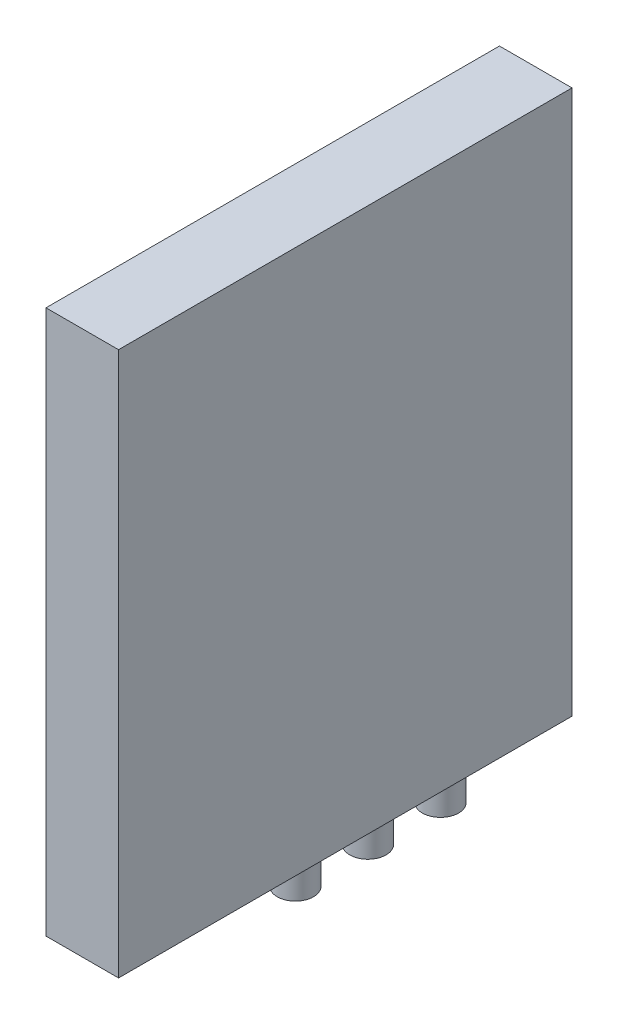
ISO-10303-21;
HEADER;
FILE_DESCRIPTION(('STEP AP214'),'2;1');
FILE_NAME('part.step','',(''),(''),'','','');
FILE_SCHEMA(('AUTOMOTIVE_DESIGN { 1 0 10303 214 1 1 1 1 }'));
ENDSEC;
DATA;
#1=APPLICATION_CONTEXT('core data for automotive mechanical design processes');
#2=APPLICATION_PROTOCOL_DEFINITION('international standard','automotive_design',2000,#1);
#3=PRODUCT_CONTEXT('',#1,'mechanical');
#4=PRODUCT('Part','Part','',(#3));
#5=PRODUCT_RELATED_PRODUCT_CATEGORY('part','',(#4));
#6=PRODUCT_DEFINITION_FORMATION('','',#4);
#7=PRODUCT_DEFINITION_CONTEXT('part definition',#1,'design');
#8=PRODUCT_DEFINITION('design','',#6,#7);
#9=PRODUCT_DEFINITION_SHAPE('','',#8);
#10=(LENGTH_UNIT() NAMED_UNIT(*) SI_UNIT(.MILLI.,.METRE.));
#11=(NAMED_UNIT(*) PLANE_ANGLE_UNIT() SI_UNIT($,.RADIAN.));
#12=(NAMED_UNIT(*) SI_UNIT($,.STERADIAN.) SOLID_ANGLE_UNIT());
#13=UNCERTAINTY_MEASURE_WITH_UNIT(LENGTH_MEASURE(1.E-05),#10,'distance_accuracy_value','');
#14=(GEOMETRIC_REPRESENTATION_CONTEXT(3) GLOBAL_UNCERTAINTY_ASSIGNED_CONTEXT((#13)) GLOBAL_UNIT_ASSIGNED_CONTEXT((#10,
#11,#12)) REPRESENTATION_CONTEXT('',''));
#15=CARTESIAN_POINT('',(0.,0.,0.));
#16=DIRECTION('',(0.,0.,1.));
#17=DIRECTION('',(1.,0.,0.));
#18=AXIS2_PLACEMENT_3D('',#15,#16,#17);
#19=CARTESIAN_POINT('',(-15.731065886484,60.,0.));
#20=DIRECTION('',(1.,0.,0.));
#21=DIRECTION('',(0.,0.,-1.));
#22=AXIS2_PLACEMENT_3D('',#19,#20,#21);
#23=PLANE('',#22);
#24=DIRECTION('',(0.,0.,1.));
#25=VECTOR('',#24,1.);
#26=CARTESIAN_POINT('',(-15.731065886484,0.,0.));
#27=LINE('',#26,#25);
#28=CARTESIAN_POINT('',(-15.731065886484,0.,-31.3784858787446));
#29=VERTEX_POINT('',#28);
#30=CARTESIAN_POINT('',(-15.731065886484,0.,18.6215141212554));
#31=VERTEX_POINT('',#30);
#32=EDGE_CURVE('E104',#29,#31,#27,.T.);
#33=ORIENTED_EDGE('',*,*,#32,.F.);
#34=DIRECTION('',(0.,-1.,0.));
#35=VECTOR('',#34,1.);
#36=CARTESIAN_POINT('',(-15.731065886484,60.,-31.3784858787446));
#37=LINE('',#36,#35);
#38=CARTESIAN_POINT('',(-15.731065886484,60.,-31.3784858787446));
#39=VERTEX_POINT('',#38);
#40=EDGE_CURVE('E79',#39,#29,#37,.T.);
#41=ORIENTED_EDGE('',*,*,#40,.F.);
#42=DIRECTION('',(0.,0.,1.));
#43=VECTOR('',#42,1.);
#44=CARTESIAN_POINT('',(-15.731065886484,60.,0.));
#45=LINE('',#44,#43);
#46=CARTESIAN_POINT('',(-15.731065886484,60.,18.6215141212554));
#47=VERTEX_POINT('',#46);
#48=EDGE_CURVE('E97',#39,#47,#45,.T.);
#49=ORIENTED_EDGE('',*,*,#48,.T.);
#50=DIRECTION('',(0.,-1.,0.));
#51=VECTOR('',#50,1.);
#52=CARTESIAN_POINT('',(-15.731065886484,60.,18.6215141212554));
#53=LINE('',#52,#51);
#54=EDGE_CURVE('E75',#47,#31,#53,.T.);
#55=ORIENTED_EDGE('',*,*,#54,.T.);
#56=EDGE_LOOP('',(#33,#41,#49,#55));
#57=FACE_BOUND('',#56,.T.);
#58=ADVANCED_FACE('F36',(#57),#23,.T.);
#59=CARTESIAN_POINT('',(0.,60.,-31.3784858787446));
#60=DIRECTION('',(0.,0.,-1.));
#61=DIRECTION('',(-1.,0.,0.));
#62=AXIS2_PLACEMENT_3D('',#59,#60,#61);
#63=PLANE('',#62);
#64=DIRECTION('',(1.,0.,0.));
#65=VECTOR('',#64,1.);
#66=CARTESIAN_POINT('',(0.,0.,-31.3784858787446));
#67=LINE('',#66,#65);
#68=CARTESIAN_POINT('',(-23.731065886484,0.,-31.3784858787446));
#69=VERTEX_POINT('',#68);
#70=EDGE_CURVE('E90',#69,#29,#67,.T.);
#71=ORIENTED_EDGE('',*,*,#70,.F.);
#72=DIRECTION('',(0.,-1.,0.));
#73=VECTOR('',#72,1.);
#74=CARTESIAN_POINT('',(-23.731065886484,60.,-31.3784858787446));
#75=LINE('',#74,#73);
#76=CARTESIAN_POINT('',(-23.731065886484,60.,-31.3784858787446));
#77=VERTEX_POINT('',#76);
#78=EDGE_CURVE('E84',#77,#69,#75,.T.);
#79=ORIENTED_EDGE('',*,*,#78,.F.);
#80=DIRECTION('',(1.,0.,0.));
#81=VECTOR('',#80,1.);
#82=CARTESIAN_POINT('',(0.,60.,-31.3784858787446));
#83=LINE('',#82,#81);
#84=EDGE_CURVE('E88',#77,#39,#83,.T.);
#85=ORIENTED_EDGE('',*,*,#84,.T.);
#86=ORIENTED_EDGE('',*,*,#40,.T.);
#87=EDGE_LOOP('',(#71,#79,#85,#86));
#88=FACE_BOUND('',#87,.T.);
#89=ADVANCED_FACE('F86',(#88),#63,.T.);
#90=CARTESIAN_POINT('',(-23.731065886484,60.,0.));
#91=DIRECTION('',(1.,0.,0.));
#92=DIRECTION('',(0.,0.,-1.));
#93=AXIS2_PLACEMENT_3D('',#90,#91,#92);
#94=PLANE('',#93);
#95=DIRECTION('',(0.,0.,1.));
#96=VECTOR('',#95,1.);
#97=CARTESIAN_POINT('',(-23.731065886484,0.,0.));
#98=LINE('',#97,#96);
#99=CARTESIAN_POINT('',(-23.731065886484,0.,18.6215141212554));
#100=VERTEX_POINT('',#99);
#101=EDGE_CURVE('E68',#69,#100,#98,.T.);
#102=ORIENTED_EDGE('',*,*,#101,.T.);
#103=DIRECTION('',(0.,-1.,0.));
#104=VECTOR('',#103,1.);
#105=CARTESIAN_POINT('',(-23.731065886484,60.,18.6215141212554));
#106=LINE('',#105,#104);
#107=CARTESIAN_POINT('',(-23.731065886484,60.,18.6215141212554));
#108=VERTEX_POINT('',#107);
#109=EDGE_CURVE('E91',#108,#100,#106,.T.);
#110=ORIENTED_EDGE('',*,*,#109,.F.);
#111=DIRECTION('',(0.,0.,1.));
#112=VECTOR('',#111,1.);
#113=CARTESIAN_POINT('',(-23.731065886484,60.,0.));
#114=LINE('',#113,#112);
#115=EDGE_CURVE('E93',#77,#108,#114,.T.);
#116=ORIENTED_EDGE('',*,*,#115,.F.);
#117=ORIENTED_EDGE('',*,*,#78,.T.);
#118=EDGE_LOOP('',(#102,#110,#116,#117));
#119=FACE_BOUND('',#118,.T.);
#120=ADVANCED_FACE('F94',(#119),#94,.F.);
#121=CARTESIAN_POINT('',(0.,60.,18.6215141212554));
#122=DIRECTION('',(0.,0.,-1.));
#123=DIRECTION('',(-1.,0.,0.));
#124=AXIS2_PLACEMENT_3D('',#121,#122,#123);
#125=PLANE('',#124);
#126=DIRECTION('',(1.,0.,0.));
#127=VECTOR('',#126,1.);
#128=CARTESIAN_POINT('',(0.,0.,18.6215141212554));
#129=LINE('',#128,#127);
#130=EDGE_CURVE('E99',#100,#31,#129,.T.);
#131=ORIENTED_EDGE('',*,*,#130,.T.);
#132=ORIENTED_EDGE('',*,*,#54,.F.);
#133=DIRECTION('',(1.,0.,0.));
#134=VECTOR('',#133,1.);
#135=CARTESIAN_POINT('',(0.,60.,18.6215141212554));
#136=LINE('',#135,#134);
#137=EDGE_CURVE('E52',#108,#47,#136,.T.);
#138=ORIENTED_EDGE('',*,*,#137,.F.);
#139=ORIENTED_EDGE('',*,*,#109,.T.);
#140=EDGE_LOOP('',(#131,#132,#138,#139));
#141=FACE_BOUND('',#140,.T.);
#142=ADVANCED_FACE('F137',(#141),#125,.F.);
#143=CARTESIAN_POINT('',(0.,60.,0.));
#144=DIRECTION('',(0.,1.,0.));
#145=DIRECTION('',(0.,0.,1.));
#146=AXIS2_PLACEMENT_3D('',#143,#144,#145);
#147=PLANE('',#146);
#148=ORIENTED_EDGE('',*,*,#48,.F.);
#149=ORIENTED_EDGE('',*,*,#84,.F.);
#150=ORIENTED_EDGE('',*,*,#115,.T.);
#151=ORIENTED_EDGE('',*,*,#137,.T.);
#152=EDGE_LOOP('',(#148,#149,#150,#151));
#153=FACE_BOUND('',#152,.T.);
#154=ADVANCED_FACE('F96',(#153),#147,.T.);
#155=CARTESIAN_POINT('',(0.,0.,0.));
#156=DIRECTION('',(0.,1.,0.));
#157=DIRECTION('',(0.,0.,1.));
#158=AXIS2_PLACEMENT_3D('',#155,#156,#157);
#159=PLANE('',#158);
#160=CARTESIAN_POINT('',(-19.7310658864838,0.,-20.8784858787442));
#161=DIRECTION('',(0.,1.,0.));
#162=DIRECTION('',(0.,0.,1.));
#163=AXIS2_PLACEMENT_3D('',#160,#161,#162);
#164=CIRCLE('',#163,2.);
#165=CARTESIAN_POINT('',(-19.7310658864838,0.,-18.8784858787442));
#166=VERTEX_POINT('',#165);
#167=EDGE_CURVE('E11',#166,#166,#164,.F.);
#168=ORIENTED_EDGE('',*,*,#167,.F.);
#169=EDGE_LOOP('',(#168));
#170=FACE_BOUND('',#169,.T.);
#171=CARTESIAN_POINT('',(-19.7310658864839,0.,-12.8784858787442));
#172=DIRECTION('',(0.,1.,0.));
#173=DIRECTION('',(0.,0.,1.));
#174=AXIS2_PLACEMENT_3D('',#171,#172,#173);
#175=CIRCLE('',#174,2.);
#176=CARTESIAN_POINT('',(-19.7310658864839,0.,-10.8784858787442));
#177=VERTEX_POINT('',#176);
#178=EDGE_CURVE('E44',#177,#177,#175,.F.);
#179=ORIENTED_EDGE('',*,*,#178,.F.);
#180=EDGE_LOOP('',(#179));
#181=FACE_BOUND('',#180,.T.);
#182=CARTESIAN_POINT('',(-19.731065886484,0.,-4.87848587874416));
#183=DIRECTION('',(0.,1.,0.));
#184=DIRECTION('',(0.,0.,1.));
#185=AXIS2_PLACEMENT_3D('',#182,#183,#184);
#186=CIRCLE('',#185,2.);
#187=CARTESIAN_POINT('',(-19.731065886484,0.,-2.87848587874417));
#188=VERTEX_POINT('',#187);
#189=EDGE_CURVE('E114',#188,#188,#186,.F.);
#190=ORIENTED_EDGE('',*,*,#189,.F.);
#191=EDGE_LOOP('',(#190));
#192=FACE_BOUND('',#191,.T.);
#193=ORIENTED_EDGE('',*,*,#32,.T.);
#194=ORIENTED_EDGE('',*,*,#130,.F.);
#195=ORIENTED_EDGE('',*,*,#101,.F.);
#196=ORIENTED_EDGE('',*,*,#70,.T.);
#197=EDGE_LOOP('',(#193,#194,#195,#196));
#198=FACE_BOUND('',#197,.T.);
#199=ADVANCED_FACE('F121',(#170,#181,#192,#198),#159,.F.);
#200=CARTESIAN_POINT('',(-19.731065886484,-5.,-4.87848587874416));
#201=DIRECTION('',(0.,1.,0.));
#202=DIRECTION('',(0.,0.,1.));
#203=AXIS2_PLACEMENT_3D('',#200,#201,#202);
#204=CYLINDRICAL_SURFACE('',#203,2.);
#205=CARTESIAN_POINT('',(-19.731065886484,-5.,-4.87848587874416));
#206=DIRECTION('',(0.,-1.,0.));
#207=DIRECTION('',(0.,0.,-1.));
#208=AXIS2_PLACEMENT_3D('',#205,#206,#207);
#209=CIRCLE('',#208,2.);
#210=CARTESIAN_POINT('',(-19.731065886484,-5.,-6.87848587874416));
#211=VERTEX_POINT('',#210);
#212=EDGE_CURVE('E107',#211,#211,#209,.T.);
#213=ORIENTED_EDGE('',*,*,#212,.F.);
#214=EDGE_LOOP('',(#213));
#215=FACE_BOUND('',#214,.T.);
#216=ORIENTED_EDGE('',*,*,#189,.T.);
#217=EDGE_LOOP('',(#216));
#218=FACE_BOUND('',#217,.T.);
#219=ADVANCED_FACE('F124',(#215,#218),#204,.T.);
#220=CARTESIAN_POINT('',(-19.731065886484,-5.,-4.87848587874416));
#221=DIRECTION('',(0.,-1.,0.));
#222=DIRECTION('',(0.,0.,-1.));
#223=AXIS2_PLACEMENT_3D('',#220,#221,#222);
#224=PLANE('',#223);
#225=ORIENTED_EDGE('',*,*,#212,.T.);
#226=EDGE_LOOP('',(#225));
#227=FACE_BOUND('',#226,.T.);
#228=ADVANCED_FACE('F147',(#227),#224,.T.);
#229=CARTESIAN_POINT('',(-19.7310658864839,-5.,-12.8784858787442));
#230=DIRECTION('',(0.,1.,0.));
#231=DIRECTION('',(0.,0.,1.));
#232=AXIS2_PLACEMENT_3D('',#229,#230,#231);
#233=CYLINDRICAL_SURFACE('',#232,2.);
#234=CARTESIAN_POINT('',(-19.7310658864839,-5.,-12.8784858787442));
#235=DIRECTION('',(0.,-1.,0.));
#236=DIRECTION('',(0.,0.,-1.));
#237=AXIS2_PLACEMENT_3D('',#234,#235,#236);
#238=CIRCLE('',#237,2.);
#239=CARTESIAN_POINT('',(-19.7310658864839,-5.,-14.8784858787442));
#240=VERTEX_POINT('',#239);
#241=EDGE_CURVE('E171',#240,#240,#238,.T.);
#242=ORIENTED_EDGE('',*,*,#241,.F.);
#243=EDGE_LOOP('',(#242));
#244=FACE_BOUND('',#243,.T.);
#245=ORIENTED_EDGE('',*,*,#178,.T.);
#246=EDGE_LOOP('',(#245));
#247=FACE_BOUND('',#246,.T.);
#248=ADVANCED_FACE('F119',(#244,#247),#233,.T.);
#249=CARTESIAN_POINT('',(-19.7310658864839,-5.,-12.8784858787442));
#250=DIRECTION('',(0.,-1.,0.));
#251=DIRECTION('',(0.,0.,-1.));
#252=AXIS2_PLACEMENT_3D('',#249,#250,#251);
#253=PLANE('',#252);
#254=ORIENTED_EDGE('',*,*,#241,.T.);
#255=EDGE_LOOP('',(#254));
#256=FACE_BOUND('',#255,.T.);
#257=ADVANCED_FACE('F154',(#256),#253,.T.);
#258=CARTESIAN_POINT('',(-19.7310658864838,-5.,-20.8784858787442));
#259=DIRECTION('',(0.,1.,0.));
#260=DIRECTION('',(0.,0.,1.));
#261=AXIS2_PLACEMENT_3D('',#258,#259,#260);
#262=CYLINDRICAL_SURFACE('',#261,2.);
#263=CARTESIAN_POINT('',(-19.7310658864838,-5.,-20.8784858787442));
#264=DIRECTION('',(0.,-1.,0.));
#265=DIRECTION('',(0.,0.,-1.));
#266=AXIS2_PLACEMENT_3D('',#263,#264,#265);
#267=CIRCLE('',#266,2.);
#268=CARTESIAN_POINT('',(-19.7310658864838,-5.,-22.8784858787442));
#269=VERTEX_POINT('',#268);
#270=EDGE_CURVE('E170',#269,#269,#267,.T.);
#271=ORIENTED_EDGE('',*,*,#270,.F.);
#272=EDGE_LOOP('',(#271));
#273=FACE_BOUND('',#272,.T.);
#274=ORIENTED_EDGE('',*,*,#167,.T.);
#275=EDGE_LOOP('',(#274));
#276=FACE_BOUND('',#275,.T.);
#277=ADVANCED_FACE('F158',(#273,#276),#262,.T.);
#278=CARTESIAN_POINT('',(-19.7310658864838,-5.,-20.8784858787442));
#279=DIRECTION('',(0.,-1.,0.));
#280=DIRECTION('',(0.,0.,-1.));
#281=AXIS2_PLACEMENT_3D('',#278,#279,#280);
#282=PLANE('',#281);
#283=ORIENTED_EDGE('',*,*,#270,.T.);
#284=EDGE_LOOP('',(#283));
#285=FACE_BOUND('',#284,.T.);
#286=ADVANCED_FACE('F162',(#285),#282,.T.);
#287=CLOSED_SHELL('',(#58,#89,#120,#142,#154,#199,#219,#228,#248,#257,#277,#286));
#288=MANIFOLD_SOLID_BREP('B2',#287);
#289=ADVANCED_BREP_SHAPE_REPRESENTATION('',(#18,#288),#14);
#290=SHAPE_DEFINITION_REPRESENTATION(#9,#289);
ENDSEC;
END-ISO-10303-21;
